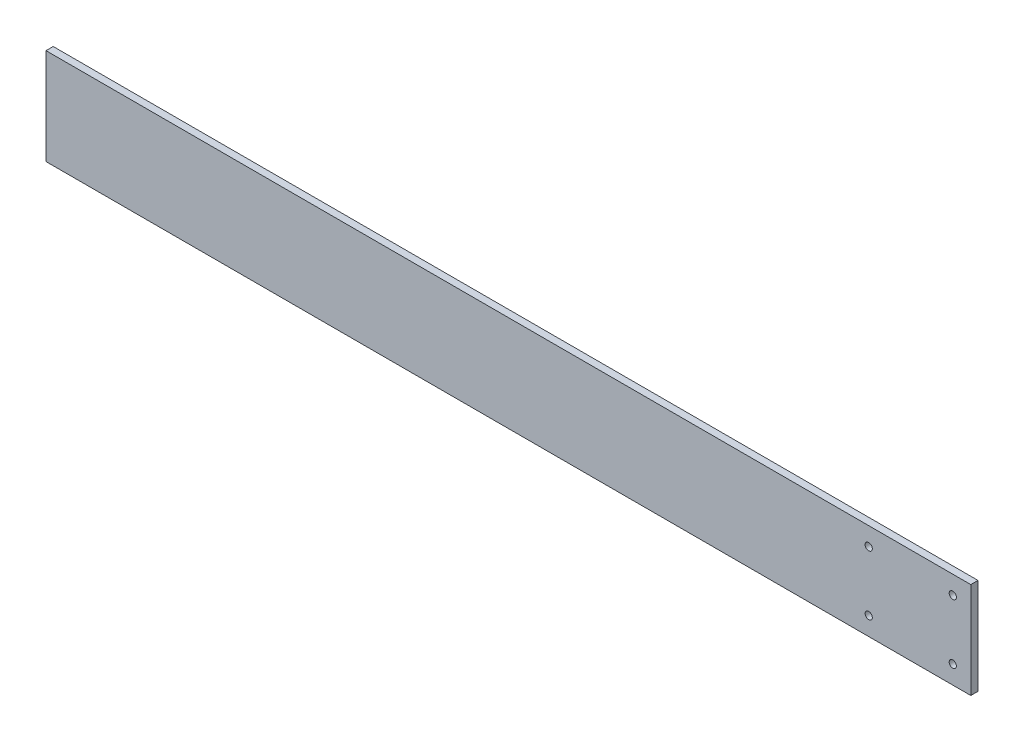
ISO-10303-21;
HEADER;
FILE_DESCRIPTION(('STEP AP214'),'2;1');
FILE_NAME('part.step','',(''),(''),'','','');
FILE_SCHEMA(('AUTOMOTIVE_DESIGN { 1 0 10303 214 1 1 1 1 }'));
ENDSEC;
DATA;
#1=APPLICATION_CONTEXT('core data for automotive mechanical design processes');
#2=APPLICATION_PROTOCOL_DEFINITION('international standard','automotive_design',2000,#1);
#3=PRODUCT_CONTEXT('',#1,'mechanical');
#4=PRODUCT('Part','Part','',(#3));
#5=PRODUCT_RELATED_PRODUCT_CATEGORY('part','',(#4));
#6=PRODUCT_DEFINITION_FORMATION('','',#4);
#7=PRODUCT_DEFINITION_CONTEXT('part definition',#1,'design');
#8=PRODUCT_DEFINITION('design','',#6,#7);
#9=PRODUCT_DEFINITION_SHAPE('','',#8);
#10=(LENGTH_UNIT() NAMED_UNIT(*) SI_UNIT(.MILLI.,.METRE.));
#11=(NAMED_UNIT(*) PLANE_ANGLE_UNIT() SI_UNIT($,.RADIAN.));
#12=(NAMED_UNIT(*) SI_UNIT($,.STERADIAN.) SOLID_ANGLE_UNIT());
#13=UNCERTAINTY_MEASURE_WITH_UNIT(LENGTH_MEASURE(1.E-05),#10,'distance_accuracy_value','');
#14=(GEOMETRIC_REPRESENTATION_CONTEXT(3) GLOBAL_UNCERTAINTY_ASSIGNED_CONTEXT((#13)) GLOBAL_UNIT_ASSIGNED_CONTEXT((#10,
#11,#12)) REPRESENTATION_CONTEXT('',''));
#15=CARTESIAN_POINT('',(0.,0.,0.));
#16=DIRECTION('',(0.,0.,1.));
#17=DIRECTION('',(1.,0.,0.));
#18=AXIS2_PLACEMENT_3D('',#15,#16,#17);
#19=CARTESIAN_POINT('',(192.5,-20.,3.));
#20=DIRECTION('',(-1.,0.,0.));
#21=DIRECTION('',(0.,0.,1.));
#22=AXIS2_PLACEMENT_3D('',#19,#20,#21);
#23=PLANE('',#22);
#24=DIRECTION('',(0.,1.,0.));
#25=VECTOR('',#24,1.);
#26=CARTESIAN_POINT('',(192.5,-20.,0.));
#27=LINE('',#26,#25);
#28=CARTESIAN_POINT('',(192.5,-20.,0.));
#29=VERTEX_POINT('',#28);
#30=CARTESIAN_POINT('',(192.5,20.,0.));
#31=VERTEX_POINT('',#30);
#32=EDGE_CURVE('E107',#29,#31,#27,.T.);
#33=ORIENTED_EDGE('',*,*,#32,.T.);
#34=DIRECTION('',(0.,0.,-1.));
#35=VECTOR('',#34,1.);
#36=CARTESIAN_POINT('',(192.5,20.,3.));
#37=LINE('',#36,#35);
#38=CARTESIAN_POINT('',(192.5,20.,3.));
#39=VERTEX_POINT('',#38);
#40=EDGE_CURVE('E11',#39,#31,#37,.T.);
#41=ORIENTED_EDGE('',*,*,#40,.F.);
#42=DIRECTION('',(0.,1.,0.));
#43=VECTOR('',#42,1.);
#44=CARTESIAN_POINT('',(192.5,-20.,3.));
#45=LINE('',#44,#43);
#46=CARTESIAN_POINT('',(192.5,-20.,3.));
#47=VERTEX_POINT('',#46);
#48=EDGE_CURVE('E91',#47,#39,#45,.T.);
#49=ORIENTED_EDGE('',*,*,#48,.F.);
#50=DIRECTION('',(0.,0.,-1.));
#51=VECTOR('',#50,1.);
#52=CARTESIAN_POINT('',(192.5,-20.,3.));
#53=LINE('',#52,#51);
#54=EDGE_CURVE('E103',#47,#29,#53,.T.);
#55=ORIENTED_EDGE('',*,*,#54,.T.);
#56=EDGE_LOOP('',(#33,#41,#49,#55));
#57=FACE_BOUND('',#56,.T.);
#58=ADVANCED_FACE('F39',(#57),#23,.F.);
#59=CARTESIAN_POINT('',(-192.5,20.,3.));
#60=DIRECTION('',(0.,-1.,0.));
#61=DIRECTION('',(0.,0.,-1.));
#62=AXIS2_PLACEMENT_3D('',#59,#60,#61);
#63=PLANE('',#62);
#64=DIRECTION('',(-1.,0.,0.));
#65=VECTOR('',#64,1.);
#66=CARTESIAN_POINT('',(-192.5,20.,0.));
#67=LINE('',#66,#65);
#68=CARTESIAN_POINT('',(-192.5,20.,0.));
#69=VERTEX_POINT('',#68);
#70=EDGE_CURVE('E96',#31,#69,#67,.T.);
#71=ORIENTED_EDGE('',*,*,#70,.T.);
#72=DIRECTION('',(0.,0.,-1.));
#73=VECTOR('',#72,1.);
#74=CARTESIAN_POINT('',(-192.5,20.,3.));
#75=LINE('',#74,#73);
#76=CARTESIAN_POINT('',(-192.5,20.,3.));
#77=VERTEX_POINT('',#76);
#78=EDGE_CURVE('E48',#77,#69,#75,.T.);
#79=ORIENTED_EDGE('',*,*,#78,.F.);
#80=DIRECTION('',(-1.,0.,0.));
#81=VECTOR('',#80,1.);
#82=CARTESIAN_POINT('',(-192.5,20.,3.));
#83=LINE('',#82,#81);
#84=EDGE_CURVE('E86',#39,#77,#83,.T.);
#85=ORIENTED_EDGE('',*,*,#84,.F.);
#86=ORIENTED_EDGE('',*,*,#40,.T.);
#87=EDGE_LOOP('',(#71,#79,#85,#86));
#88=FACE_BOUND('',#87,.T.);
#89=ADVANCED_FACE('F95',(#88),#63,.F.);
#90=CARTESIAN_POINT('',(-192.5,-20.,3.));
#91=DIRECTION('',(1.,0.,0.));
#92=DIRECTION('',(0.,0.,-1.));
#93=AXIS2_PLACEMENT_3D('',#90,#91,#92);
#94=PLANE('',#93);
#95=DIRECTION('',(0.,-1.,0.));
#96=VECTOR('',#95,1.);
#97=CARTESIAN_POINT('',(-192.5,-20.,0.));
#98=LINE('',#97,#96);
#99=CARTESIAN_POINT('',(-192.5,-20.,0.));
#100=VERTEX_POINT('',#99);
#101=EDGE_CURVE('E73',#69,#100,#98,.T.);
#102=ORIENTED_EDGE('',*,*,#101,.T.);
#103=DIRECTION('',(0.,0.,-1.));
#104=VECTOR('',#103,1.);
#105=CARTESIAN_POINT('',(-192.5,-20.,3.));
#106=LINE('',#105,#104);
#107=CARTESIAN_POINT('',(-192.5,-20.,3.));
#108=VERTEX_POINT('',#107);
#109=EDGE_CURVE('E98',#108,#100,#106,.T.);
#110=ORIENTED_EDGE('',*,*,#109,.F.);
#111=DIRECTION('',(0.,-1.,0.));
#112=VECTOR('',#111,1.);
#113=CARTESIAN_POINT('',(-192.5,-20.,3.));
#114=LINE('',#113,#112);
#115=EDGE_CURVE('E89',#77,#108,#114,.T.);
#116=ORIENTED_EDGE('',*,*,#115,.F.);
#117=ORIENTED_EDGE('',*,*,#78,.T.);
#118=EDGE_LOOP('',(#102,#110,#116,#117));
#119=FACE_BOUND('',#118,.T.);
#120=ADVANCED_FACE('F99',(#119),#94,.F.);
#121=CARTESIAN_POINT('',(-192.5,-20.,3.));
#122=DIRECTION('',(0.,1.,0.));
#123=DIRECTION('',(0.,0.,1.));
#124=AXIS2_PLACEMENT_3D('',#121,#122,#123);
#125=PLANE('',#124);
#126=DIRECTION('',(1.,0.,0.));
#127=VECTOR('',#126,1.);
#128=CARTESIAN_POINT('',(-192.5,-20.,0.));
#129=LINE('',#128,#127);
#130=EDGE_CURVE('E79',#100,#29,#129,.T.);
#131=ORIENTED_EDGE('',*,*,#130,.T.);
#132=ORIENTED_EDGE('',*,*,#54,.F.);
#133=DIRECTION('',(1.,0.,0.));
#134=VECTOR('',#133,1.);
#135=CARTESIAN_POINT('',(-192.5,-20.,3.));
#136=LINE('',#135,#134);
#137=EDGE_CURVE('E56',#108,#47,#136,.T.);
#138=ORIENTED_EDGE('',*,*,#137,.F.);
#139=ORIENTED_EDGE('',*,*,#109,.T.);
#140=EDGE_LOOP('',(#131,#132,#138,#139));
#141=FACE_BOUND('',#140,.T.);
#142=ADVANCED_FACE('F121',(#141),#125,.F.);
#143=CARTESIAN_POINT('',(0.,0.,3.));
#144=DIRECTION('',(0.,0.,-1.));
#145=DIRECTION('',(-1.,0.,0.));
#146=AXIS2_PLACEMENT_3D('',#143,#144,#145);
#147=PLANE('',#146);
#148=CARTESIAN_POINT('',(150.,12.4206356042729,3.));
#149=DIRECTION('',(0.,0.,-1.));
#150=DIRECTION('',(-1.,0.,0.));
#151=AXIS2_PLACEMENT_3D('',#148,#149,#150);
#152=CIRCLE('',#151,1.5);
#153=CARTESIAN_POINT('',(148.5,12.4206356042729,3.));
#154=VERTEX_POINT('',#153);
#155=EDGE_CURVE('E111',#154,#154,#152,.T.);
#156=ORIENTED_EDGE('',*,*,#155,.T.);
#157=EDGE_LOOP('',(#156));
#158=FACE_BOUND('',#157,.T.);
#159=CARTESIAN_POINT('',(185.,-12.4206356042729,3.));
#160=DIRECTION('',(0.,0.,-1.));
#161=DIRECTION('',(-1.,0.,0.));
#162=AXIS2_PLACEMENT_3D('',#159,#160,#161);
#163=CIRCLE('',#162,1.5);
#164=CARTESIAN_POINT('',(183.5,-12.4206356042729,3.));
#165=VERTEX_POINT('',#164);
#166=EDGE_CURVE('E131',#165,#165,#163,.T.);
#167=ORIENTED_EDGE('',*,*,#166,.T.);
#168=EDGE_LOOP('',(#167));
#169=FACE_BOUND('',#168,.T.);
#170=CARTESIAN_POINT('',(185.,12.4206356042729,3.));
#171=DIRECTION('',(0.,0.,-1.));
#172=DIRECTION('',(-1.,0.,0.));
#173=AXIS2_PLACEMENT_3D('',#170,#171,#172);
#174=CIRCLE('',#173,1.5);
#175=CARTESIAN_POINT('',(183.5,12.4206356042729,3.));
#176=VERTEX_POINT('',#175);
#177=EDGE_CURVE('E135',#176,#176,#174,.T.);
#178=ORIENTED_EDGE('',*,*,#177,.T.);
#179=EDGE_LOOP('',(#178));
#180=FACE_BOUND('',#179,.T.);
#181=CARTESIAN_POINT('',(150.,-12.420635604273,3.));
#182=DIRECTION('',(0.,0.,-1.));
#183=DIRECTION('',(-1.,0.,0.));
#184=AXIS2_PLACEMENT_3D('',#181,#182,#183);
#185=CIRCLE('',#184,1.5);
#186=CARTESIAN_POINT('',(148.5,-12.420635604273,3.));
#187=VERTEX_POINT('',#186);
#188=EDGE_CURVE('E139',#187,#187,#185,.T.);
#189=ORIENTED_EDGE('',*,*,#188,.T.);
#190=EDGE_LOOP('',(#189));
#191=FACE_BOUND('',#190,.T.);
#192=ORIENTED_EDGE('',*,*,#48,.T.);
#193=ORIENTED_EDGE('',*,*,#84,.T.);
#194=ORIENTED_EDGE('',*,*,#115,.T.);
#195=ORIENTED_EDGE('',*,*,#137,.T.);
#196=EDGE_LOOP('',(#192,#193,#194,#195));
#197=FACE_BOUND('',#196,.T.);
#198=ADVANCED_FACE('F87',(#158,#169,#180,#191,#197),#147,.F.);
#199=CARTESIAN_POINT('',(0.,0.,0.));
#200=DIRECTION('',(0.,0.,-1.));
#201=DIRECTION('',(-1.,0.,0.));
#202=AXIS2_PLACEMENT_3D('',#199,#200,#201);
#203=PLANE('',#202);
#204=CARTESIAN_POINT('',(150.,12.4206356042729,0.));
#205=DIRECTION('',(0.,0.,1.));
#206=DIRECTION('',(-1.,0.,0.));
#207=AXIS2_PLACEMENT_3D('',#204,#205,#206);
#208=CIRCLE('',#207,1.5);
#209=CARTESIAN_POINT('',(148.5,12.4206356042729,0.));
#210=VERTEX_POINT('',#209);
#211=EDGE_CURVE('E148',#210,#210,#208,.T.);
#212=ORIENTED_EDGE('',*,*,#211,.T.);
#213=EDGE_LOOP('',(#212));
#214=FACE_BOUND('',#213,.T.);
#215=CARTESIAN_POINT('',(185.,-12.4206356042729,0.));
#216=DIRECTION('',(0.,0.,1.));
#217=DIRECTION('',(-1.,0.,0.));
#218=AXIS2_PLACEMENT_3D('',#215,#216,#217);
#219=CIRCLE('',#218,1.5);
#220=CARTESIAN_POINT('',(183.5,-12.4206356042729,0.));
#221=VERTEX_POINT('',#220);
#222=EDGE_CURVE('E152',#221,#221,#219,.T.);
#223=ORIENTED_EDGE('',*,*,#222,.T.);
#224=EDGE_LOOP('',(#223));
#225=FACE_BOUND('',#224,.T.);
#226=CARTESIAN_POINT('',(185.,12.4206356042729,0.));
#227=DIRECTION('',(0.,0.,1.));
#228=DIRECTION('',(1.,0.,0.));
#229=AXIS2_PLACEMENT_3D('',#226,#227,#228);
#230=CIRCLE('',#229,1.5);
#231=CARTESIAN_POINT('',(186.5,12.4206356042729,0.));
#232=VERTEX_POINT('',#231);
#233=EDGE_CURVE('E147',#232,#232,#230,.T.);
#234=ORIENTED_EDGE('',*,*,#233,.T.);
#235=EDGE_LOOP('',(#234));
#236=FACE_BOUND('',#235,.T.);
#237=CARTESIAN_POINT('',(150.,-12.420635604273,0.));
#238=DIRECTION('',(0.,0.,1.));
#239=DIRECTION('',(1.,0.,0.));
#240=AXIS2_PLACEMENT_3D('',#237,#238,#239);
#241=CIRCLE('',#240,1.5);
#242=CARTESIAN_POINT('',(151.5,-12.420635604273,0.));
#243=VERTEX_POINT('',#242);
#244=EDGE_CURVE('E143',#243,#243,#241,.T.);
#245=ORIENTED_EDGE('',*,*,#244,.T.);
#246=EDGE_LOOP('',(#245));
#247=FACE_BOUND('',#246,.T.);
#248=ORIENTED_EDGE('',*,*,#32,.F.);
#249=ORIENTED_EDGE('',*,*,#130,.F.);
#250=ORIENTED_EDGE('',*,*,#101,.F.);
#251=ORIENTED_EDGE('',*,*,#70,.F.);
#252=EDGE_LOOP('',(#248,#249,#250,#251));
#253=FACE_BOUND('',#252,.T.);
#254=ADVANCED_FACE('F124',(#214,#225,#236,#247,#253),#203,.T.);
#255=CARTESIAN_POINT('',(150.,-12.420635604273,0.));
#256=DIRECTION('',(0.,0.,1.));
#257=DIRECTION('',(1.,0.,0.));
#258=AXIS2_PLACEMENT_3D('',#255,#256,#257);
#259=CYLINDRICAL_SURFACE('',#258,1.5);
#260=ORIENTED_EDGE('',*,*,#244,.F.);
#261=EDGE_LOOP('',(#260));
#262=FACE_BOUND('',#261,.T.);
#263=ORIENTED_EDGE('',*,*,#188,.F.);
#264=EDGE_LOOP('',(#263));
#265=FACE_BOUND('',#264,.T.);
#266=ADVANCED_FACE('F166',(#262,#265),#259,.F.);
#267=CARTESIAN_POINT('',(185.,12.4206356042729,0.));
#268=DIRECTION('',(0.,0.,1.));
#269=DIRECTION('',(1.,0.,0.));
#270=AXIS2_PLACEMENT_3D('',#267,#268,#269);
#271=CYLINDRICAL_SURFACE('',#270,1.5);
#272=ORIENTED_EDGE('',*,*,#233,.F.);
#273=EDGE_LOOP('',(#272));
#274=FACE_BOUND('',#273,.T.);
#275=ORIENTED_EDGE('',*,*,#177,.F.);
#276=EDGE_LOOP('',(#275));
#277=FACE_BOUND('',#276,.T.);
#278=ADVANCED_FACE('F162',(#274,#277),#271,.F.);
#279=CARTESIAN_POINT('',(185.,-12.4206356042729,0.));
#280=DIRECTION('',(0.,0.,1.));
#281=DIRECTION('',(1.,0.,0.));
#282=AXIS2_PLACEMENT_3D('',#279,#280,#281);
#283=CYLINDRICAL_SURFACE('',#282,1.5);
#284=ORIENTED_EDGE('',*,*,#222,.F.);
#285=EDGE_LOOP('',(#284));
#286=FACE_BOUND('',#285,.T.);
#287=ORIENTED_EDGE('',*,*,#166,.F.);
#288=EDGE_LOOP('',(#287));
#289=FACE_BOUND('',#288,.T.);
#290=ADVANCED_FACE('F165',(#286,#289),#283,.F.);
#291=CARTESIAN_POINT('',(150.,12.4206356042729,0.));
#292=DIRECTION('',(0.,0.,1.));
#293=DIRECTION('',(1.,0.,0.));
#294=AXIS2_PLACEMENT_3D('',#291,#292,#293);
#295=CYLINDRICAL_SURFACE('',#294,1.5);
#296=ORIENTED_EDGE('',*,*,#211,.F.);
#297=EDGE_LOOP('',(#296));
#298=FACE_BOUND('',#297,.T.);
#299=ORIENTED_EDGE('',*,*,#155,.F.);
#300=EDGE_LOOP('',(#299));
#301=FACE_BOUND('',#300,.T.);
#302=ADVANCED_FACE('F229',(#298,#301),#295,.F.);
#303=CLOSED_SHELL('',(#58,#89,#120,#142,#198,#254,#266,#278,#290,#302));
#304=MANIFOLD_SOLID_BREP('B2',#303);
#305=ADVANCED_BREP_SHAPE_REPRESENTATION('',(#18,#304),#14);
#306=SHAPE_DEFINITION_REPRESENTATION(#9,#305);
ENDSEC;
END-ISO-10303-21;
